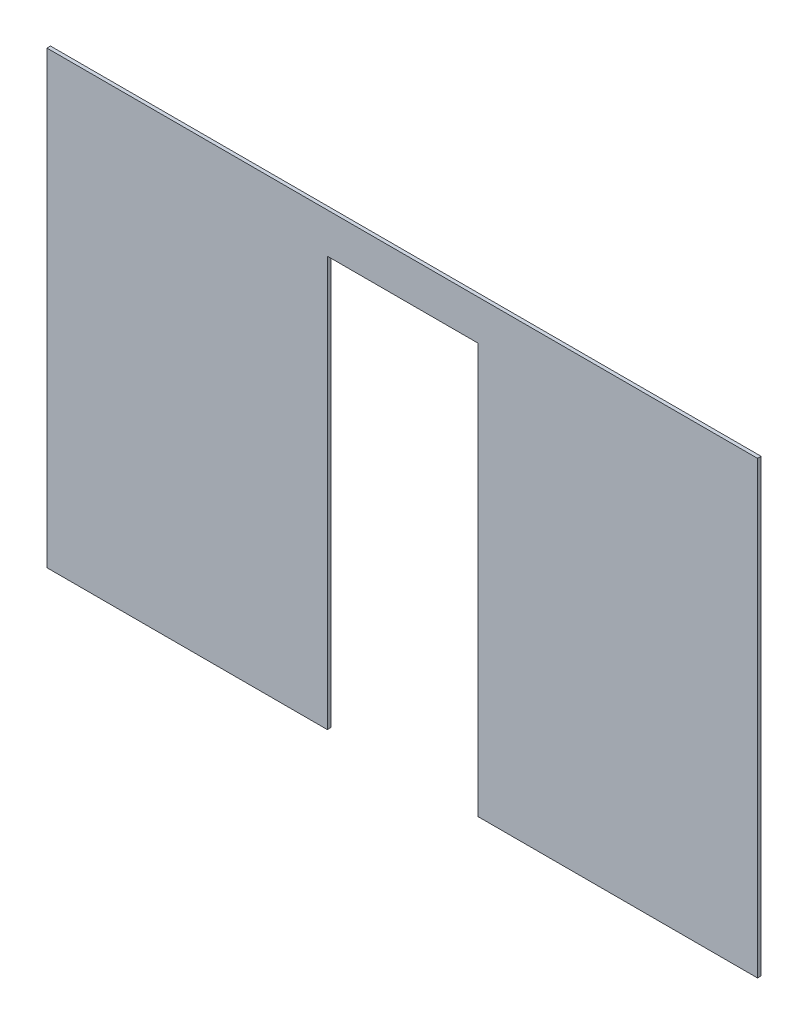
ISO-10303-21;
HEADER;
FILE_DESCRIPTION(('STEP AP214'),'2;1');
FILE_NAME('part.step','',(''),(''),'','','');
FILE_SCHEMA(('AUTOMOTIVE_DESIGN { 1 0 10303 214 1 1 1 1 }'));
ENDSEC;
DATA;
#1=APPLICATION_CONTEXT('core data for automotive mechanical design processes');
#2=APPLICATION_PROTOCOL_DEFINITION('international standard','automotive_design',2000,#1);
#3=PRODUCT_CONTEXT('',#1,'mechanical');
#4=PRODUCT('Part','Part','',(#3));
#5=PRODUCT_RELATED_PRODUCT_CATEGORY('part','',(#4));
#6=PRODUCT_DEFINITION_FORMATION('','',#4);
#7=PRODUCT_DEFINITION_CONTEXT('part definition',#1,'design');
#8=PRODUCT_DEFINITION('design','',#6,#7);
#9=PRODUCT_DEFINITION_SHAPE('','',#8);
#10=(LENGTH_UNIT() NAMED_UNIT(*) SI_UNIT(.MILLI.,.METRE.));
#11=(NAMED_UNIT(*) PLANE_ANGLE_UNIT() SI_UNIT($,.RADIAN.));
#12=(NAMED_UNIT(*) SI_UNIT($,.STERADIAN.) SOLID_ANGLE_UNIT());
#13=UNCERTAINTY_MEASURE_WITH_UNIT(LENGTH_MEASURE(1.E-05),#10,'distance_accuracy_value','');
#14=(GEOMETRIC_REPRESENTATION_CONTEXT(3) GLOBAL_UNCERTAINTY_ASSIGNED_CONTEXT((#13)) GLOBAL_UNIT_ASSIGNED_CONTEXT((#10,
#11,#12)) REPRESENTATION_CONTEXT('',''));
#15=CARTESIAN_POINT('',(0.,0.,0.));
#16=DIRECTION('',(0.,0.,1.));
#17=DIRECTION('',(1.,0.,0.));
#18=AXIS2_PLACEMENT_3D('',#15,#16,#17);
#19=CARTESIAN_POINT('',(300.,-190.,3.));
#20=DIRECTION('',(0.,1.,0.));
#21=DIRECTION('',(-1.,0.,0.));
#22=AXIS2_PLACEMENT_3D('',#19,#20,#21);
#23=PLANE('',#22);
#24=DIRECTION('',(1.,0.,0.));
#25=VECTOR('',#24,1.);
#26=CARTESIAN_POINT('',(300.,-190.,0.));
#27=LINE('',#26,#25);
#28=CARTESIAN_POINT('',(-300.,-190.,0.));
#29=VERTEX_POINT('',#28);
#30=CARTESIAN_POINT('',(-63.2651519454549,-190.,0.));
#31=VERTEX_POINT('',#30);
#32=EDGE_CURVE('E155',#29,#31,#27,.T.);
#33=ORIENTED_EDGE('',*,*,#32,.T.);
#34=DIRECTION('',(0.,0.,-1.));
#35=VECTOR('',#34,1.);
#36=CARTESIAN_POINT('',(-63.2651519454549,-190.,10.));
#37=LINE('',#36,#35);
#38=CARTESIAN_POINT('',(-63.2651519454549,-190.,3.));
#39=VERTEX_POINT('',#38);
#40=EDGE_CURVE('E136',#39,#31,#37,.T.);
#41=ORIENTED_EDGE('',*,*,#40,.F.);
#42=DIRECTION('',(1.,0.,0.));
#43=VECTOR('',#42,1.);
#44=CARTESIAN_POINT('',(300.,-190.,3.));
#45=LINE('',#44,#43);
#46=CARTESIAN_POINT('',(-300.,-190.,3.));
#47=VERTEX_POINT('',#46);
#48=EDGE_CURVE('E87',#47,#39,#45,.T.);
#49=ORIENTED_EDGE('',*,*,#48,.F.);
#50=DIRECTION('',(0.,0.,-1.));
#51=VECTOR('',#50,1.);
#52=CARTESIAN_POINT('',(-300.,-190.,3.));
#53=LINE('',#52,#51);
#54=EDGE_CURVE('E11',#47,#29,#53,.T.);
#55=ORIENTED_EDGE('',*,*,#54,.T.);
#56=EDGE_LOOP('',(#33,#41,#49,#55));
#57=FACE_BOUND('',#56,.T.);
#58=ADVANCED_FACE('F35',(#57),#23,.F.);
#59=CARTESIAN_POINT('',(-300.,-190.,3.));
#60=DIRECTION('',(1.,0.,0.));
#61=DIRECTION('',(0.,0.,-1.));
#62=AXIS2_PLACEMENT_3D('',#59,#60,#61);
#63=PLANE('',#62);
#64=DIRECTION('',(0.,-1.,0.));
#65=VECTOR('',#64,1.);
#66=CARTESIAN_POINT('',(-300.,-190.,0.));
#67=LINE('',#66,#65);
#68=CARTESIAN_POINT('',(-300.,190.,0.));
#69=VERTEX_POINT('',#68);
#70=EDGE_CURVE('E144',#69,#29,#67,.T.);
#71=ORIENTED_EDGE('',*,*,#70,.T.);
#72=ORIENTED_EDGE('',*,*,#54,.F.);
#73=DIRECTION('',(0.,-1.,0.));
#74=VECTOR('',#73,1.);
#75=CARTESIAN_POINT('',(-300.,-190.,3.));
#76=LINE('',#75,#74);
#77=CARTESIAN_POINT('',(-300.,190.,3.));
#78=VERTEX_POINT('',#77);
#79=EDGE_CURVE('E145',#78,#47,#76,.T.);
#80=ORIENTED_EDGE('',*,*,#79,.F.);
#81=DIRECTION('',(0.,0.,-1.));
#82=VECTOR('',#81,1.);
#83=CARTESIAN_POINT('',(-300.,190.,3.));
#84=LINE('',#83,#82);
#85=EDGE_CURVE('E152',#78,#69,#84,.T.);
#86=ORIENTED_EDGE('',*,*,#85,.T.);
#87=EDGE_LOOP('',(#71,#72,#80,#86));
#88=FACE_BOUND('',#87,.T.);
#89=ADVANCED_FACE('F37',(#88),#63,.F.);
#90=CARTESIAN_POINT('',(64.0932488495214,-190.,3.));
#91=VERTEX_POINT('',#90);
#92=CARTESIAN_POINT('',(300.,-190.,3.));
#93=VERTEX_POINT('',#92);
#94=EDGE_CURVE('E147',#91,#93,#45,.T.);
#95=ORIENTED_EDGE('',*,*,#94,.F.);
#96=DIRECTION('',(0.,0.,-1.));
#97=VECTOR('',#96,1.);
#98=CARTESIAN_POINT('',(64.0932488495214,-190.,10.));
#99=LINE('',#98,#97);
#100=CARTESIAN_POINT('',(64.0932488495214,-190.,0.));
#101=VERTEX_POINT('',#100);
#102=EDGE_CURVE('E120',#91,#101,#99,.T.);
#103=ORIENTED_EDGE('',*,*,#102,.T.);
#104=CARTESIAN_POINT('',(300.,-190.,0.));
#105=VERTEX_POINT('',#104);
#106=EDGE_CURVE('E131',#101,#105,#27,.T.);
#107=ORIENTED_EDGE('',*,*,#106,.T.);
#108=DIRECTION('',(0.,0.,-1.));
#109=VECTOR('',#108,1.);
#110=CARTESIAN_POINT('',(300.,-190.,3.));
#111=LINE('',#110,#109);
#112=EDGE_CURVE('E43',#93,#105,#111,.T.);
#113=ORIENTED_EDGE('',*,*,#112,.F.);
#114=EDGE_LOOP('',(#95,#103,#107,#113));
#115=FACE_BOUND('',#114,.T.);
#116=ADVANCED_FACE('F185',(#115),#23,.F.);
#117=CARTESIAN_POINT('',(300.,-190.,3.));
#118=DIRECTION('',(-1.,0.,0.));
#119=DIRECTION('',(0.,-1.,0.));
#120=AXIS2_PLACEMENT_3D('',#117,#118,#119);
#121=PLANE('',#120);
#122=DIRECTION('',(0.,1.,0.));
#123=VECTOR('',#122,1.);
#124=CARTESIAN_POINT('',(300.,-190.,0.));
#125=LINE('',#124,#123);
#126=CARTESIAN_POINT('',(300.,190.,0.));
#127=VERTEX_POINT('',#126);
#128=EDGE_CURVE('E158',#105,#127,#125,.T.);
#129=ORIENTED_EDGE('',*,*,#128,.T.);
#130=DIRECTION('',(0.,0.,-1.));
#131=VECTOR('',#130,1.);
#132=CARTESIAN_POINT('',(300.,190.,3.));
#133=LINE('',#132,#131);
#134=CARTESIAN_POINT('',(300.,190.,3.));
#135=VERTEX_POINT('',#134);
#136=EDGE_CURVE('E162',#135,#127,#133,.T.);
#137=ORIENTED_EDGE('',*,*,#136,.F.);
#138=DIRECTION('',(0.,1.,0.));
#139=VECTOR('',#138,1.);
#140=CARTESIAN_POINT('',(300.,-190.,3.));
#141=LINE('',#140,#139);
#142=EDGE_CURVE('E149',#93,#135,#141,.T.);
#143=ORIENTED_EDGE('',*,*,#142,.F.);
#144=ORIENTED_EDGE('',*,*,#112,.T.);
#145=EDGE_LOOP('',(#129,#137,#143,#144));
#146=FACE_BOUND('',#145,.T.);
#147=ADVANCED_FACE('F167',(#146),#121,.F.);
#148=CARTESIAN_POINT('',(300.,190.,3.));
#149=DIRECTION('',(0.,-1.,0.));
#150=DIRECTION('',(1.,0.,0.));
#151=AXIS2_PLACEMENT_3D('',#148,#149,#150);
#152=PLANE('',#151);
#153=DIRECTION('',(-1.,0.,0.));
#154=VECTOR('',#153,1.);
#155=CARTESIAN_POINT('',(300.,190.,0.));
#156=LINE('',#155,#154);
#157=EDGE_CURVE('E80',#127,#69,#156,.T.);
#158=ORIENTED_EDGE('',*,*,#157,.T.);
#159=ORIENTED_EDGE('',*,*,#85,.F.);
#160=DIRECTION('',(-1.,0.,0.));
#161=VECTOR('',#160,1.);
#162=CARTESIAN_POINT('',(300.,190.,3.));
#163=LINE('',#162,#161);
#164=EDGE_CURVE('E59',#135,#78,#163,.T.);
#165=ORIENTED_EDGE('',*,*,#164,.F.);
#166=ORIENTED_EDGE('',*,*,#136,.T.);
#167=EDGE_LOOP('',(#158,#159,#165,#166));
#168=FACE_BOUND('',#167,.T.);
#169=ADVANCED_FACE('F175',(#168),#152,.F.);
#170=CARTESIAN_POINT('',(0.,0.,3.));
#171=DIRECTION('',(0.,0.,1.));
#172=DIRECTION('',(1.,0.,0.));
#173=AXIS2_PLACEMENT_3D('',#170,#171,#172);
#174=PLANE('',#173);
#175=DIRECTION('',(0.,-1.,0.));
#176=VECTOR('',#175,1.);
#177=CARTESIAN_POINT('',(-63.2651519454549,0.,3.));
#178=LINE('',#177,#176);
#179=CARTESIAN_POINT('',(-63.2651519454549,156.213758298259,3.));
#180=VERTEX_POINT('',#179);
#181=EDGE_CURVE('E142',#180,#39,#178,.T.);
#182=ORIENTED_EDGE('',*,*,#181,.F.);
#183=DIRECTION('',(-1.,0.,0.));
#184=VECTOR('',#183,1.);
#185=CARTESIAN_POINT('',(0.,156.213758298259,3.));
#186=LINE('',#185,#184);
#187=CARTESIAN_POINT('',(64.0932488495214,156.213758298259,3.));
#188=VERTEX_POINT('',#187);
#189=EDGE_CURVE('E138',#188,#180,#186,.T.);
#190=ORIENTED_EDGE('',*,*,#189,.F.);
#191=DIRECTION('',(0.,1.,0.));
#192=VECTOR('',#191,1.);
#193=CARTESIAN_POINT('',(64.0932488495214,0.,3.));
#194=LINE('',#193,#192);
#195=EDGE_CURVE('E117',#91,#188,#194,.T.);
#196=ORIENTED_EDGE('',*,*,#195,.F.);
#197=ORIENTED_EDGE('',*,*,#94,.T.);
#198=ORIENTED_EDGE('',*,*,#142,.T.);
#199=ORIENTED_EDGE('',*,*,#164,.T.);
#200=ORIENTED_EDGE('',*,*,#79,.T.);
#201=ORIENTED_EDGE('',*,*,#48,.T.);
#202=EDGE_LOOP('',(#182,#190,#196,#197,#198,#199,#200,#201));
#203=FACE_BOUND('',#202,.T.);
#204=ADVANCED_FACE('F177',(#203),#174,.T.);
#205=CARTESIAN_POINT('',(0.,0.,0.));
#206=DIRECTION('',(0.,0.,1.));
#207=DIRECTION('',(1.,0.,0.));
#208=AXIS2_PLACEMENT_3D('',#205,#206,#207);
#209=PLANE('',#208);
#210=DIRECTION('',(1.,0.,0.));
#211=VECTOR('',#210,1.);
#212=CARTESIAN_POINT('',(-63.2651519454549,156.213758298259,0.));
#213=LINE('',#212,#211);
#214=CARTESIAN_POINT('',(-63.2651519454549,156.213758298259,0.));
#215=VERTEX_POINT('',#214);
#216=CARTESIAN_POINT('',(64.0932488495214,156.213758298259,0.));
#217=VERTEX_POINT('',#216);
#218=EDGE_CURVE('E124',#215,#217,#213,.T.);
#219=ORIENTED_EDGE('',*,*,#218,.F.);
#220=DIRECTION('',(0.,1.,0.));
#221=VECTOR('',#220,1.);
#222=CARTESIAN_POINT('',(-63.2651519454549,-190.,0.));
#223=LINE('',#222,#221);
#224=EDGE_CURVE('E50',#31,#215,#223,.T.);
#225=ORIENTED_EDGE('',*,*,#224,.F.);
#226=ORIENTED_EDGE('',*,*,#32,.F.);
#227=ORIENTED_EDGE('',*,*,#70,.F.);
#228=ORIENTED_EDGE('',*,*,#157,.F.);
#229=ORIENTED_EDGE('',*,*,#128,.F.);
#230=ORIENTED_EDGE('',*,*,#106,.F.);
#231=DIRECTION('',(0.,-1.,0.));
#232=VECTOR('',#231,1.);
#233=CARTESIAN_POINT('',(64.0932488495214,-190.,0.));
#234=LINE('',#233,#232);
#235=EDGE_CURVE('E114',#217,#101,#234,.T.);
#236=ORIENTED_EDGE('',*,*,#235,.F.);
#237=EDGE_LOOP('',(#219,#225,#226,#227,#228,#229,#230,#236));
#238=FACE_BOUND('',#237,.T.);
#239=ADVANCED_FACE('F129',(#238),#209,.F.);
#240=CARTESIAN_POINT('',(-63.2651519454549,-190.,10.));
#241=DIRECTION('',(-1.,0.,0.));
#242=DIRECTION('',(0.,0.,1.));
#243=AXIS2_PLACEMENT_3D('',#240,#241,#242);
#244=PLANE('',#243);
#245=ORIENTED_EDGE('',*,*,#181,.T.);
#246=ORIENTED_EDGE('',*,*,#40,.T.);
#247=ORIENTED_EDGE('',*,*,#224,.T.);
#248=DIRECTION('',(0.,0.,-1.));
#249=VECTOR('',#248,1.);
#250=CARTESIAN_POINT('',(-63.2651519454549,156.213758298259,10.));
#251=LINE('',#250,#249);
#252=EDGE_CURVE('E121',#180,#215,#251,.T.);
#253=ORIENTED_EDGE('',*,*,#252,.F.);
#254=EDGE_LOOP('',(#245,#246,#247,#253));
#255=FACE_BOUND('',#254,.T.);
#256=ADVANCED_FACE('F196',(#255),#244,.F.);
#257=CARTESIAN_POINT('',(64.0932488495214,-190.,10.));
#258=DIRECTION('',(1.,0.,0.));
#259=DIRECTION('',(0.,0.,-1.));
#260=AXIS2_PLACEMENT_3D('',#257,#258,#259);
#261=PLANE('',#260);
#262=ORIENTED_EDGE('',*,*,#195,.T.);
#263=DIRECTION('',(0.,0.,-1.));
#264=VECTOR('',#263,1.);
#265=CARTESIAN_POINT('',(64.0932488495214,156.213758298259,10.));
#266=LINE('',#265,#264);
#267=EDGE_CURVE('E110',#188,#217,#266,.T.);
#268=ORIENTED_EDGE('',*,*,#267,.T.);
#269=ORIENTED_EDGE('',*,*,#235,.T.);
#270=ORIENTED_EDGE('',*,*,#102,.F.);
#271=EDGE_LOOP('',(#262,#268,#269,#270));
#272=FACE_BOUND('',#271,.T.);
#273=ADVANCED_FACE('F112',(#272),#261,.F.);
#274=CARTESIAN_POINT('',(-63.2651519454549,156.213758298259,10.));
#275=DIRECTION('',(0.,1.,0.));
#276=DIRECTION('',(0.,0.,1.));
#277=AXIS2_PLACEMENT_3D('',#274,#275,#276);
#278=PLANE('',#277);
#279=ORIENTED_EDGE('',*,*,#189,.T.);
#280=ORIENTED_EDGE('',*,*,#252,.T.);
#281=ORIENTED_EDGE('',*,*,#218,.T.);
#282=ORIENTED_EDGE('',*,*,#267,.F.);
#283=EDGE_LOOP('',(#279,#280,#281,#282));
#284=FACE_BOUND('',#283,.T.);
#285=ADVANCED_FACE('F125',(#284),#278,.F.);
#286=CLOSED_SHELL('',(#58,#89,#116,#147,#169,#204,#239,#256,#273,#285));
#287=MANIFOLD_SOLID_BREP('B2',#286);
#288=ADVANCED_BREP_SHAPE_REPRESENTATION('',(#18,#287),#14);
#289=SHAPE_DEFINITION_REPRESENTATION(#9,#288);
ENDSEC;
END-ISO-10303-21;
